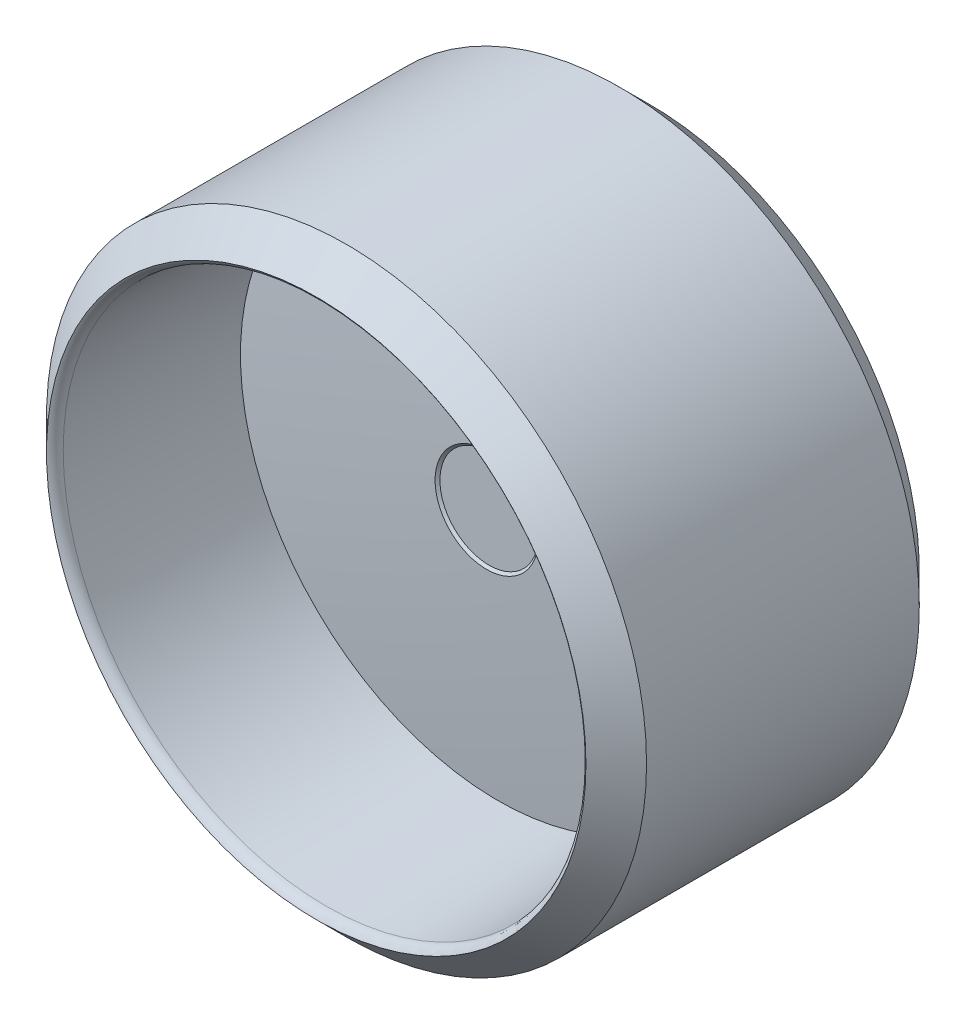
ISO-10303-21;
HEADER;
FILE_DESCRIPTION(('STEP AP214'),'2;1');
FILE_NAME('part.step','',(''),(''),'','','');
FILE_SCHEMA(('AUTOMOTIVE_DESIGN { 1 0 10303 214 1 1 1 1 }'));
ENDSEC;
DATA;
#1=APPLICATION_CONTEXT('core data for automotive mechanical design processes');
#2=APPLICATION_PROTOCOL_DEFINITION('international standard','automotive_design',2000,#1);
#3=PRODUCT_CONTEXT('',#1,'mechanical');
#4=PRODUCT('Part','Part','',(#3));
#5=PRODUCT_RELATED_PRODUCT_CATEGORY('part','',(#4));
#6=PRODUCT_DEFINITION_FORMATION('','',#4);
#7=PRODUCT_DEFINITION_CONTEXT('part definition',#1,'design');
#8=PRODUCT_DEFINITION('design','',#6,#7);
#9=PRODUCT_DEFINITION_SHAPE('','',#8);
#10=(LENGTH_UNIT() NAMED_UNIT(*) SI_UNIT(.MILLI.,.METRE.));
#11=(NAMED_UNIT(*) PLANE_ANGLE_UNIT() SI_UNIT($,.RADIAN.));
#12=(NAMED_UNIT(*) SI_UNIT($,.STERADIAN.) SOLID_ANGLE_UNIT());
#13=UNCERTAINTY_MEASURE_WITH_UNIT(LENGTH_MEASURE(1.E-05),#10,'distance_accuracy_value','');
#14=(GEOMETRIC_REPRESENTATION_CONTEXT(3) GLOBAL_UNCERTAINTY_ASSIGNED_CONTEXT((#13)) GLOBAL_UNIT_ASSIGNED_CONTEXT((#10,
#11,#12)) REPRESENTATION_CONTEXT('',''));
#15=CARTESIAN_POINT('',(0.,0.,0.));
#16=DIRECTION('',(0.,0.,1.));
#17=DIRECTION('',(1.,0.,0.));
#18=AXIS2_PLACEMENT_3D('',#15,#16,#17);
#19=CARTESIAN_POINT('',(0.,0.,0.));
#20=DIRECTION('',(0.,0.,-1.));
#21=DIRECTION('',(-1.,0.,0.));
#22=AXIS2_PLACEMENT_3D('',#19,#20,#21);
#23=PLANE('',#22);
#24=CARTESIAN_POINT('',(0.,0.,0.));
#25=DIRECTION('',(0.,0.,1.));
#26=DIRECTION('',(1.,0.,0.));
#27=AXIS2_PLACEMENT_3D('',#24,#25,#26);
#28=CIRCLE('',#27,4.);
#29=CARTESIAN_POINT('',(4.,0.,0.));
#30=VERTEX_POINT('',#29);
#31=EDGE_CURVE('E66',#30,#30,#28,.T.);
#32=ORIENTED_EDGE('',*,*,#31,.F.);
#33=EDGE_LOOP('',(#32));
#34=FACE_BOUND('',#33,.T.);
#35=ADVANCED_FACE('F31',(#34),#23,.T.);
#36=CARTESIAN_POINT('',(0.,0.,-2.));
#37=DIRECTION('',(0.,0.,-1.));
#38=DIRECTION('',(-1.,0.,0.));
#39=AXIS2_PLACEMENT_3D('',#36,#37,#38);
#40=CONICAL_SURFACE('',#39,5.89470027858602,0.758368079501479);
#41=CARTESIAN_POINT('',(0.,0.,-1.87509506141449));
#42=DIRECTION('',(0.,0.,1.));
#43=DIRECTION('',(1.,0.,0.));
#44=AXIS2_PLACEMENT_3D('',#41,#42,#43);
#45=CIRCLE('',#44,5.77637156761865);
#46=CARTESIAN_POINT('',(5.77637156761865,0.,-1.87509506141449));
#47=VERTEX_POINT('',#46);
#48=EDGE_CURVE('E42',#47,#47,#45,.F.);
#49=ORIENTED_EDGE('',*,*,#48,.T.);
#50=EDGE_LOOP('',(#49));
#51=FACE_BOUND('',#50,.T.);
#52=ORIENTED_EDGE('',*,*,#31,.T.);
#53=EDGE_LOOP('',(#52));
#54=FACE_BOUND('',#53,.T.);
#55=ADVANCED_FACE('F90',(#51,#54),#40,.F.);
#56=CARTESIAN_POINT('',(5.89470027858602,0.,-2.));
#57=DIRECTION('',(0.,0.,-1.));
#58=DIRECTION('',(-1.,0.,0.));
#59=AXIS2_PLACEMENT_3D('',#56,#57,#58);
#60=PLANE('',#59);
#61=CARTESIAN_POINT('',(0.,0.,-2.));
#62=DIRECTION('',(0.,0.,-1.));
#63=DIRECTION('',(-1.,0.,0.));
#64=AXIS2_PLACEMENT_3D('',#61,#62,#63);
#65=CIRCLE('',#64,6.06675529165525);
#66=CARTESIAN_POINT('',(-6.06675529165525,0.,-2.));
#67=VERTEX_POINT('',#66);
#68=EDGE_CURVE('E46',#67,#67,#65,.F.);
#69=ORIENTED_EDGE('',*,*,#68,.T.);
#70=EDGE_LOOP('',(#69));
#71=FACE_BOUND('',#70,.T.);
#72=CARTESIAN_POINT('',(0.,0.,-2.));
#73=DIRECTION('',(0.,0.,-1.));
#74=DIRECTION('',(-1.,0.,0.));
#75=AXIS2_PLACEMENT_3D('',#72,#73,#74);
#76=CIRCLE('',#75,8.9);
#77=CARTESIAN_POINT('',(-8.9,0.,-2.));
#78=VERTEX_POINT('',#77);
#79=EDGE_CURVE('E57',#78,#78,#76,.T.);
#80=ORIENTED_EDGE('',*,*,#79,.T.);
#81=EDGE_LOOP('',(#80));
#82=FACE_BOUND('',#81,.T.);
#83=ADVANCED_FACE('F86',(#71,#82),#60,.T.);
#84=CARTESIAN_POINT('',(0.,0.,3.));
#85=DIRECTION('',(0.,0.,1.));
#86=DIRECTION('',(1.,0.,0.));
#87=AXIS2_PLACEMENT_3D('',#84,#85,#86);
#88=CYLINDRICAL_SURFACE('',#87,9.9);
#89=CARTESIAN_POINT('',(0.,0.,-1.));
#90=DIRECTION('',(0.,0.,-1.));
#91=DIRECTION('',(-1.,0.,0.));
#92=AXIS2_PLACEMENT_3D('',#89,#90,#91);
#93=CIRCLE('',#92,9.9);
#94=CARTESIAN_POINT('',(-9.9,0.,-1.));
#95=VERTEX_POINT('',#94);
#96=EDGE_CURVE('E60',#95,#95,#93,.F.);
#97=ORIENTED_EDGE('',*,*,#96,.T.);
#98=EDGE_LOOP('',(#97));
#99=FACE_BOUND('',#98,.T.);
#100=CARTESIAN_POINT('',(0.,0.,7.99999999999999));
#101=DIRECTION('',(0.,0.,1.));
#102=DIRECTION('',(1.,0.,0.));
#103=AXIS2_PLACEMENT_3D('',#100,#101,#102);
#104=CIRCLE('',#103,9.9);
#105=CARTESIAN_POINT('',(9.9,0.,7.99999999999999));
#106=VERTEX_POINT('',#105);
#107=EDGE_CURVE('E63',#106,#106,#104,.F.);
#108=ORIENTED_EDGE('',*,*,#107,.T.);
#109=EDGE_LOOP('',(#108));
#110=FACE_BOUND('',#109,.T.);
#111=ADVANCED_FACE('F77',(#99,#110),#88,.T.);
#112=CARTESIAN_POINT('',(0.,0.,3.));
#113=DIRECTION('',(0.,0.,1.));
#114=DIRECTION('',(1.,0.,0.));
#115=AXIS2_PLACEMENT_3D('',#112,#113,#114);
#116=CONICAL_SURFACE('',#115,8.5,0.0333209958782484);
#117=CARTESIAN_POINT('',(0.,0.,8.66050548055486));
#118=DIRECTION('',(0.,0.,1.));
#119=DIRECTION('',(1.,0.,0.));
#120=AXIS2_PLACEMENT_3D('',#117,#118,#119);
#121=CIRCLE('',#120,8.68868351601851);
#122=CARTESIAN_POINT('',(8.68868351601851,0.,8.66050548055486));
#123=VERTEX_POINT('',#122);
#124=EDGE_CURVE('E51',#123,#123,#121,.T.);
#125=ORIENTED_EDGE('',*,*,#124,.T.);
#126=EDGE_LOOP('',(#125));
#127=FACE_BOUND('',#126,.T.);
#128=CARTESIAN_POINT('',(0.,0.,3.));
#129=DIRECTION('',(0.,0.,1.));
#130=DIRECTION('',(1.,0.,0.));
#131=AXIS2_PLACEMENT_3D('',#128,#129,#130);
#132=CIRCLE('',#131,8.5);
#133=CARTESIAN_POINT('',(8.5,0.,3.));
#134=VERTEX_POINT('',#133);
#135=EDGE_CURVE('E69',#134,#134,#132,.T.);
#136=ORIENTED_EDGE('',*,*,#135,.F.);
#137=EDGE_LOOP('',(#136));
#138=FACE_BOUND('',#137,.T.);
#139=ADVANCED_FACE('F75',(#127,#138),#116,.F.);
#140=CARTESIAN_POINT('',(0.,0.,-96.1172358193214));
#141=DIRECTION('',(0.,0.,1.));
#142=DIRECTION('',(1.,0.,0.));
#143=AXIS2_PLACEMENT_3D('',#140,#141,#142);
#144=DEGENERATE_TOROIDAL_SURFACE('',#143,0.423752273850428,99.5181380006078,.F.);
#145=CARTESIAN_POINT('',(0.,0.,3.37823131692326));
#146=DIRECTION('',(0.,0.,-1.));
#147=DIRECTION('',(-1.,0.,0.));
#148=AXIS2_PLACEMENT_3D('',#145,#146,#147);
#149=CIRCLE('',#148,1.70034999498706);
#150=CARTESIAN_POINT('',(1.70034999498706,0.,3.37823131692326));
#151=VERTEX_POINT('',#150);
#152=EDGE_CURVE('E38',#151,#151,#149,.T.);
#153=ORIENTED_EDGE('',*,*,#152,.T.);
#154=EDGE_LOOP('',(#153));
#155=FACE_BOUND('',#154,.T.);
#156=ORIENTED_EDGE('',*,*,#135,.T.);
#157=EDGE_LOOP('',(#156));
#158=FACE_BOUND('',#157,.T.);
#159=ADVANCED_FACE('F73',(#155,#158),#144,.F.);
#160=CARTESIAN_POINT('',(0.,0.,-1.));
#161=DIRECTION('',(0.,0.,1.));
#162=DIRECTION('',(1.,0.,0.));
#163=AXIS2_PLACEMENT_3D('',#160,#161,#162);
#164=CONICAL_SURFACE('',#163,9.9,0.78539816339745);
#165=ORIENTED_EDGE('',*,*,#79,.F.);
#166=EDGE_LOOP('',(#165));
#167=FACE_BOUND('',#166,.T.);
#168=ORIENTED_EDGE('',*,*,#96,.F.);
#169=EDGE_LOOP('',(#168));
#170=FACE_BOUND('',#169,.T.);
#171=ADVANCED_FACE('F84',(#167,#170),#164,.T.);
#172=CARTESIAN_POINT('',(0.,0.,9.));
#173=DIRECTION('',(0.,0.,-1.));
#174=DIRECTION('',(-1.,0.,0.));
#175=AXIS2_PLACEMENT_3D('',#172,#173,#174);
#176=CONICAL_SURFACE('',#175,8.9,0.785398163397446);
#177=ORIENTED_EDGE('',*,*,#107,.F.);
#178=EDGE_LOOP('',(#177));
#179=FACE_BOUND('',#178,.T.);
#180=CARTESIAN_POINT('',(0.,0.,9.));
#181=DIRECTION('',(0.,0.,1.));
#182=DIRECTION('',(1.,0.,0.));
#183=AXIS2_PLACEMENT_3D('',#180,#181,#182);
#184=CIRCLE('',#183,8.9);
#185=CARTESIAN_POINT('',(8.9,0.,9.));
#186=VERTEX_POINT('',#185);
#187=EDGE_CURVE('E54',#186,#186,#184,.T.);
#188=ORIENTED_EDGE('',*,*,#187,.F.);
#189=EDGE_LOOP('',(#188));
#190=FACE_BOUND('',#189,.T.);
#191=ADVANCED_FACE('F103',(#179,#190),#176,.T.);
#192=CARTESIAN_POINT('',(0.,0.,8.6471795484618));
#193=DIRECTION('',(0.,0.,1.));
#194=DIRECTION('',(1.,0.,0.));
#195=AXIS2_PLACEMENT_3D('',#192,#193,#194);
#196=TOROIDAL_SURFACE('',#195,9.08846147881016,0.4);
#197=ORIENTED_EDGE('',*,*,#187,.T.);
#198=EDGE_LOOP('',(#197));
#199=FACE_BOUND('',#198,.T.);
#200=ORIENTED_EDGE('',*,*,#124,.F.);
#201=EDGE_LOOP('',(#200));
#202=FACE_BOUND('',#201,.T.);
#203=ADVANCED_FACE('F107',(#199,#202),#196,.T.);
#204=CARTESIAN_POINT('',(0.,0.,-1.6));
#205=DIRECTION('',(0.,0.,-1.));
#206=DIRECTION('',(-1.,0.,0.));
#207=AXIS2_PLACEMENT_3D('',#204,#205,#206);
#208=TOROIDAL_SURFACE('',#207,6.06675529165525,0.4);
#209=ORIENTED_EDGE('',*,*,#48,.F.);
#210=EDGE_LOOP('',(#209));
#211=FACE_BOUND('',#210,.T.);
#212=ORIENTED_EDGE('',*,*,#68,.F.);
#213=EDGE_LOOP('',(#212));
#214=FACE_BOUND('',#213,.T.);
#215=ADVANCED_FACE('F110',(#211,#214),#208,.T.);
#216=CARTESIAN_POINT('',(0.,0.,3.3));
#217=DIRECTION('',(0.,0.,1.));
#218=DIRECTION('',(1.,0.,0.));
#219=AXIS2_PLACEMENT_3D('',#216,#217,#218);
#220=PLANE('',#219);
#221=CARTESIAN_POINT('',(0.,0.,3.3));
#222=DIRECTION('',(0.,0.,1.));
#223=DIRECTION('',(1.,0.,0.));
#224=AXIS2_PLACEMENT_3D('',#221,#222,#223);
#225=CIRCLE('',#224,1.61887308215913);
#226=CARTESIAN_POINT('',(1.61887308215913,0.,3.3));
#227=VERTEX_POINT('',#226);
#228=EDGE_CURVE('E10',#227,#227,#225,.T.);
#229=ORIENTED_EDGE('',*,*,#228,.T.);
#230=EDGE_LOOP('',(#229));
#231=FACE_BOUND('',#230,.T.);
#232=ADVANCED_FACE('F113',(#231),#220,.T.);
#233=CARTESIAN_POINT('',(0.,0.,3.18586217320635));
#234=DIRECTION('',(0.,0.,1.));
#235=DIRECTION('',(1.,0.,0.));
#236=AXIS2_PLACEMENT_3D('',#233,#234,#235);
#237=CONICAL_SURFACE('',#236,1.5,0.805717399458335);
#238=CARTESIAN_POINT('',(1.70034999498706,0.,3.37823131692326));
#239=CARTESIAN_POINT('',(1.6995012771451,0.,3.37741640737198));
#240=CARTESIAN_POINT('',(1.69865255930314,0.,3.37660149782069));
#241=CARTESIAN_POINT('',(1.69695512361923,0.,3.37497167871813));
#242=CARTESIAN_POINT('',(1.69610640577727,0.,3.37415676916684));
#243=CARTESIAN_POINT('',(1.69440897009335,0.,3.37252695006427));
#244=CARTESIAN_POINT('',(1.6935602522514,0.,3.37171204051299));
#245=CARTESIAN_POINT('',(1.69186281656748,0.,3.37008222141042));
#246=CARTESIAN_POINT('',(1.69101409872552,0.,3.36926731185914));
#247=CARTESIAN_POINT('',(1.68931666304161,0.,3.36763749275657));
#248=CARTESIAN_POINT('',(1.68846794519965,0.,3.36682258320529));
#249=CARTESIAN_POINT('',(1.68677050951573,0.,3.36519276410272));
#250=CARTESIAN_POINT('',(1.68592179167378,0.,3.36437785455143));
#251=CARTESIAN_POINT('',(1.68422435598986,0.,3.36274803544887));
#252=CARTESIAN_POINT('',(1.6833756381479,0.,3.36193312589758));
#253=CARTESIAN_POINT('',(1.68167820246399,0.,3.36030330679501));
#254=CARTESIAN_POINT('',(1.68082948462203,0.,3.35948839724373));
#255=CARTESIAN_POINT('',(1.67913204893812,0.,3.35785857814116));
#256=CARTESIAN_POINT('',(1.67828333109616,0.,3.35704366858988));
#257=CARTESIAN_POINT('',(1.67658589541224,0.,3.35541384948731));
#258=CARTESIAN_POINT('',(1.67573717757029,0.,3.35459893993603));
#259=CARTESIAN_POINT('',(1.67403974188637,0.,3.35296912083346));
#260=CARTESIAN_POINT('',(1.67319102404441,0.,3.35215421128217));
#261=CARTESIAN_POINT('',(1.6714935883605,0.,3.35052439217961));
#262=CARTESIAN_POINT('',(1.67064487051854,0.,3.34970948262832));
#263=CARTESIAN_POINT('',(1.66894743483462,0.,3.34807966352575));
#264=CARTESIAN_POINT('',(1.66809871699267,0.,3.34726475397447));
#265=CARTESIAN_POINT('',(1.66640128130875,0.,3.3456349348719));
#266=CARTESIAN_POINT('',(1.66555256346679,0.,3.34482002532062));
#267=CARTESIAN_POINT('',(1.66385512778288,0.,3.34319020621805));
#268=CARTESIAN_POINT('',(1.66300640994092,0.,3.34237529666677));
#269=CARTESIAN_POINT('',(1.66130897425701,0.,3.3407454775642));
#270=CARTESIAN_POINT('',(1.66046025641505,0.,3.33993056801291));
#271=CARTESIAN_POINT('',(1.65876282073113,0.,3.33830074891035));
#272=CARTESIAN_POINT('',(1.65791410288918,0.,3.33748583935906));
#273=CARTESIAN_POINT('',(1.65621666720526,0.,3.33585602025649));
#274=CARTESIAN_POINT('',(1.6553679493633,0.,3.33504111070521));
#275=CARTESIAN_POINT('',(1.65367051367939,0.,3.33341129160264));
#276=CARTESIAN_POINT('',(1.65282179583743,0.,3.33259638205136));
#277=CARTESIAN_POINT('',(1.65112436015352,0.,3.33096656294879));
#278=CARTESIAN_POINT('',(1.65027564231156,0.,3.33015165339751));
#279=CARTESIAN_POINT('',(1.64857820662764,0.,3.32852183429494));
#280=CARTESIAN_POINT('',(1.64772948878568,0.,3.32770692474366));
#281=CARTESIAN_POINT('',(1.64603205310177,0.,3.32607710564109));
#282=CARTESIAN_POINT('',(1.64518333525981,0.,3.3252621960898));
#283=CARTESIAN_POINT('',(1.6434858995759,0.,3.32363237698723));
#284=CARTESIAN_POINT('',(1.64263718173394,0.,3.32281746743595));
#285=CARTESIAN_POINT('',(1.64093974605002,0.,3.32118764833338));
#286=CARTESIAN_POINT('',(1.64009102820807,0.,3.3203727387821));
#287=CARTESIAN_POINT('',(1.63839359252415,0.,3.31874291967953));
#288=CARTESIAN_POINT('',(1.63754487468219,0.,3.31792801012825));
#289=CARTESIAN_POINT('',(1.63584743899828,0.,3.31629819102568));
#290=CARTESIAN_POINT('',(1.63499872115632,0.,3.3154832814744));
#291=CARTESIAN_POINT('',(1.63330128547241,0.,3.31385346237183));
#292=CARTESIAN_POINT('',(1.63245256763045,0.,3.31303855282054));
#293=CARTESIAN_POINT('',(1.63075513194653,0.,3.31140873371798));
#294=CARTESIAN_POINT('',(1.62990641410458,0.,3.31059382416669));
#295=CARTESIAN_POINT('',(1.62820897842066,0.,3.30896400506412));
#296=CARTESIAN_POINT('',(1.6273602605787,0.,3.30814909551284));
#297=CARTESIAN_POINT('',(1.62566282489479,0.,3.30651927641027));
#298=CARTESIAN_POINT('',(1.62481410705283,0.,3.30570436685899));
#299=CARTESIAN_POINT('',(1.62311667136891,0.,3.30407454775642));
#300=CARTESIAN_POINT('',(1.62226795352696,0.,3.30325963820514));
#301=CARTESIAN_POINT('',(1.62057051784304,0.,3.30162981910257));
#302=CARTESIAN_POINT('',(1.61972180000108,0.,3.30081490955128));
#303=CARTESIAN_POINT('',(1.61887308215913,0.,3.3));
#304=B_SPLINE_CURVE_WITH_KNOTS('',3,(#238,#239,#240,#241,#242,#243,#244,#245,#246,#247,#248,
#249,#250,#251,#252,#253,#254,#255,#256,#257,#258,#259,#260,#261,#262,#263,#264,#265,#266,#267,
#268,#269,#270,#271,#272,#273,#274,#275,#276,#277,#278,#279,#280,#281,#282,#283,#284,#285,#286,
#287,#288,#289,#290,#291,#292,#293,#294,#295,#296,#297,#298,#299,#300,#301,#302,#303),
.UNSPECIFIED.,.F.,.F.,(4,2,2,2,2,2,2,2,2,2,2,2,2,2,2,2,2,2,2,2,2,2,2,2,2,2,2,2,2,2,2,2,4),(0.,
0.00352981528812475,0.0070596305762495,0.0105894458643743,0.014119261152499,0.0176490764406239,
0.0211788917287484,0.0247087070168731,0.0282385223049979,0.0317683375931226,0.0352981528812474,
0.0388279681693721,0.042357783457497,0.0458875987456213,0.0494174140337462,0.052947229321871,
0.0564770446099957,0.0600068598981205,0.0635366751862452,0.06706649047437,0.0705963057624944,
0.0741261210506193,0.0776559363387439,0.0811857516268688,0.0847155669149936,0.0882453822031183,
0.0917751974912428,0.0953050127793675,0.0988348280674922,0.102364643355617,0.105894458643742,
0.109424273931867,0.112954089219991),.UNSPECIFIED.);
#305=EDGE_CURVE('BSEAM33',#151,#227,#304,.T.);
#306=ORIENTED_EDGE('',*,*,#152,.F.);
#307=ORIENTED_EDGE('',*,*,#228,.F.);
#308=ORIENTED_EDGE('',*,*,#305,.T.);
#309=ORIENTED_EDGE('',*,*,#305,.F.);
#310=EDGE_LOOP('',(#306,#308,#307,#309));
#311=FACE_BOUND('',#310,.T.);
#312=ADVANCED_FACE('F33',(#311),#237,.F.);
#313=CLOSED_SHELL('',(#35,#55,#83,#111,#139,#159,#171,#191,#203,#215,#232,#312));
#314=MANIFOLD_SOLID_BREP('B2',#313);
#315=ADVANCED_BREP_SHAPE_REPRESENTATION('',(#18,#314),#14);
#316=SHAPE_DEFINITION_REPRESENTATION(#9,#315);
ENDSEC;
END-ISO-10303-21;
